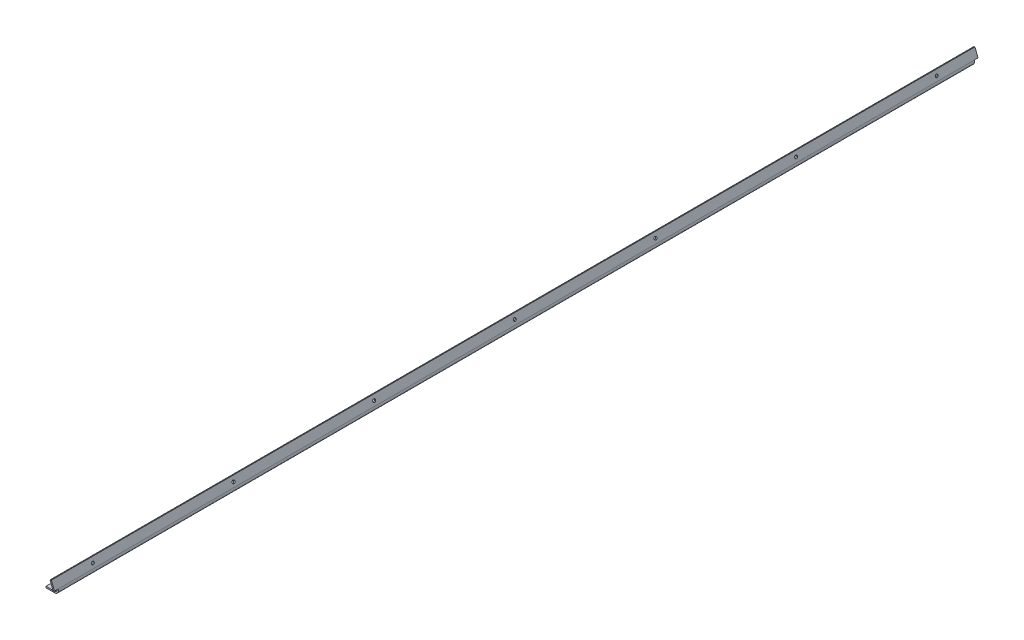
ISO-10303-21;
HEADER;
FILE_DESCRIPTION(('STEP AP214'),'2;1');
FILE_NAME('part.step','',(''),(''),'','','');
FILE_SCHEMA(('AUTOMOTIVE_DESIGN { 1 0 10303 214 1 1 1 1 }'));
ENDSEC;
DATA;
#1=APPLICATION_CONTEXT('core data for automotive mechanical design processes');
#2=APPLICATION_PROTOCOL_DEFINITION('international standard','automotive_design',2000,#1);
#3=PRODUCT_CONTEXT('',#1,'mechanical');
#4=PRODUCT('Part','Part','',(#3));
#5=PRODUCT_RELATED_PRODUCT_CATEGORY('part','',(#4));
#6=PRODUCT_DEFINITION_FORMATION('','',#4);
#7=PRODUCT_DEFINITION_CONTEXT('part definition',#1,'design');
#8=PRODUCT_DEFINITION('design','',#6,#7);
#9=PRODUCT_DEFINITION_SHAPE('','',#8);
#10=(LENGTH_UNIT() NAMED_UNIT(*) SI_UNIT(.MILLI.,.METRE.));
#11=(NAMED_UNIT(*) PLANE_ANGLE_UNIT() SI_UNIT($,.RADIAN.));
#12=(NAMED_UNIT(*) SI_UNIT($,.STERADIAN.) SOLID_ANGLE_UNIT());
#13=UNCERTAINTY_MEASURE_WITH_UNIT(LENGTH_MEASURE(1.E-05),#10,'distance_accuracy_value','');
#14=(GEOMETRIC_REPRESENTATION_CONTEXT(3) GLOBAL_UNCERTAINTY_ASSIGNED_CONTEXT((#13)) GLOBAL_UNIT_ASSIGNED_CONTEXT((#10,
#11,#12)) REPRESENTATION_CONTEXT('',''));
#15=CARTESIAN_POINT('',(0.,0.,0.));
#16=DIRECTION('',(0.,0.,1.));
#17=DIRECTION('',(1.,0.,0.));
#18=AXIS2_PLACEMENT_3D('',#15,#16,#17);
#19=CARTESIAN_POINT('',(-11.5613673458875,8.,985.));
#20=DIRECTION('',(0.,0.,-1.));
#21=DIRECTION('',(-1.,0.,0.));
#22=AXIS2_PLACEMENT_3D('',#19,#20,#21);
#23=CYLINDRICAL_SURFACE('',#22,5.);
#24=DIRECTION('',(0.,0.,-1.));
#25=VECTOR('',#24,1.);
#26=CARTESIAN_POINT('',(-6.88219611129137,9.7622021896844,985.));
#27=LINE('',#26,#25);
#28=CARTESIAN_POINT('',(-6.88219611129137,9.7622021896844,977.));
#29=VERTEX_POINT('',#28);
#30=CARTESIAN_POINT('',(-6.88219611129137,9.7622021896844,-976.999999999999));
#31=VERTEX_POINT('',#30);
#32=EDGE_CURVE('E169',#29,#31,#27,.T.);
#33=ORIENTED_EDGE('',*,*,#32,.T.);
#34=CARTESIAN_POINT('',(-11.5613673458875,8.,-977.));
#35=DIRECTION('',(0.,0.,-1.));
#36=DIRECTION('',(0.,1.,0.));
#37=AXIS2_PLACEMENT_3D('',#34,#35,#36);
#38=CIRCLE('',#37,5.);
#39=CARTESIAN_POINT('',(-11.5613673458875,3.,-977.));
#40=VERTEX_POINT('',#39);
#41=EDGE_CURVE('E216',#31,#40,#38,.T.);
#42=ORIENTED_EDGE('',*,*,#41,.T.);
#43=DIRECTION('',(0.,0.,-1.));
#44=VECTOR('',#43,1.);
#45=CARTESIAN_POINT('',(-11.5613673458875,3.,985.));
#46=LINE('',#45,#44);
#47=CARTESIAN_POINT('',(-11.5613673458875,3.,977.));
#48=VERTEX_POINT('',#47);
#49=EDGE_CURVE('E166',#48,#40,#46,.T.);
#50=ORIENTED_EDGE('',*,*,#49,.F.);
#51=CARTESIAN_POINT('',(-11.5613673458875,8.,977.));
#52=DIRECTION('',(0.,0.,-1.));
#53=DIRECTION('',(0.,1.,0.));
#54=AXIS2_PLACEMENT_3D('',#51,#52,#53);
#55=CIRCLE('',#54,5.);
#56=EDGE_CURVE('E209',#29,#48,#55,.T.);
#57=ORIENTED_EDGE('',*,*,#56,.F.);
#58=EDGE_LOOP('',(#33,#42,#50,#57));
#59=FACE_BOUND('',#58,.T.);
#60=ADVANCED_FACE('F37',(#59),#23,.F.);
#61=CARTESIAN_POINT('',(0.,3.,985.));
#62=DIRECTION('',(0.,1.,0.));
#63=DIRECTION('',(-1.,0.,0.));
#64=AXIS2_PLACEMENT_3D('',#61,#62,#63);
#65=PLANE('',#64);
#66=ORIENTED_EDGE('',*,*,#49,.T.);
#67=DIRECTION('',(-1.,0.,0.));
#68=VECTOR('',#67,1.);
#69=CARTESIAN_POINT('',(0.,3.,-977.));
#70=LINE('',#69,#68);
#71=CARTESIAN_POINT('',(-30.,3.,-977.));
#72=VERTEX_POINT('',#71);
#73=EDGE_CURVE('E142',#40,#72,#70,.T.);
#74=ORIENTED_EDGE('',*,*,#73,.T.);
#75=DIRECTION('',(0.,0.,-1.));
#76=VECTOR('',#75,1.);
#77=CARTESIAN_POINT('',(-30.,3.,985.));
#78=LINE('',#77,#76);
#79=CARTESIAN_POINT('',(-30.,3.,977.));
#80=VERTEX_POINT('',#79);
#81=EDGE_CURVE('E158',#80,#72,#78,.T.);
#82=ORIENTED_EDGE('',*,*,#81,.F.);
#83=DIRECTION('',(-1.,0.,0.));
#84=VECTOR('',#83,1.);
#85=CARTESIAN_POINT('',(0.,3.,977.));
#86=LINE('',#85,#84);
#87=EDGE_CURVE('E201',#48,#80,#86,.T.);
#88=ORIENTED_EDGE('',*,*,#87,.F.);
#89=EDGE_LOOP('',(#66,#74,#82,#88));
#90=FACE_BOUND('',#89,.T.);
#91=ADVANCED_FACE('F268',(#90),#65,.T.);
#92=CARTESIAN_POINT('',(-30.,0.,985.));
#93=DIRECTION('',(-1.,0.,0.));
#94=DIRECTION('',(0.,0.,1.));
#95=AXIS2_PLACEMENT_3D('',#92,#93,#94);
#96=PLANE('',#95);
#97=ORIENTED_EDGE('',*,*,#81,.T.);
#98=DIRECTION('',(0.,1.,0.));
#99=VECTOR('',#98,1.);
#100=CARTESIAN_POINT('',(-30.,3.,-977.));
#101=LINE('',#100,#99);
#102=CARTESIAN_POINT('',(-30.,0.,-976.999999999999));
#103=VERTEX_POINT('',#102);
#104=EDGE_CURVE('E143',#72,#103,#101,.F.);
#105=ORIENTED_EDGE('',*,*,#104,.T.);
#106=DIRECTION('',(0.,0.,-1.));
#107=VECTOR('',#106,1.);
#108=CARTESIAN_POINT('',(-30.,0.,985.));
#109=LINE('',#108,#107);
#110=CARTESIAN_POINT('',(-30.,0.,977.));
#111=VERTEX_POINT('',#110);
#112=EDGE_CURVE('E152',#111,#103,#109,.T.);
#113=ORIENTED_EDGE('',*,*,#112,.F.);
#114=DIRECTION('',(0.,-1.,0.));
#115=VECTOR('',#114,1.);
#116=CARTESIAN_POINT('',(-30.,0.,977.));
#117=LINE('',#116,#115);
#118=EDGE_CURVE('E193',#111,#80,#117,.F.);
#119=ORIENTED_EDGE('',*,*,#118,.T.);
#120=EDGE_LOOP('',(#97,#105,#113,#119));
#121=FACE_BOUND('',#120,.T.);
#122=ADVANCED_FACE('F265',(#121),#96,.T.);
#123=CARTESIAN_POINT('',(0.,0.,985.));
#124=DIRECTION('',(0.,1.,0.));
#125=DIRECTION('',(-1.,0.,0.));
#126=AXIS2_PLACEMENT_3D('',#123,#124,#125);
#127=PLANE('',#126);
#128=DIRECTION('',(-1.,0.,0.));
#129=VECTOR('',#128,1.);
#130=CARTESIAN_POINT('',(0.,0.,-976.999999999999));
#131=LINE('',#130,#129);
#132=CARTESIAN_POINT('',(-11.5613673458875,0.,-976.999999999999));
#133=VERTEX_POINT('',#132);
#134=EDGE_CURVE('E139',#133,#103,#131,.T.);
#135=ORIENTED_EDGE('',*,*,#134,.F.);
#136=DIRECTION('',(0.,0.,-1.));
#137=VECTOR('',#136,1.);
#138=CARTESIAN_POINT('',(-11.5613673458875,0.,985.));
#139=LINE('',#138,#137);
#140=CARTESIAN_POINT('',(-11.5613673458875,0.,977.));
#141=VERTEX_POINT('',#140);
#142=EDGE_CURVE('E150',#141,#133,#139,.T.);
#143=ORIENTED_EDGE('',*,*,#142,.F.);
#144=DIRECTION('',(-1.,0.,0.));
#145=VECTOR('',#144,1.);
#146=CARTESIAN_POINT('',(-3.56136734588746,0.,977.));
#147=LINE('',#146,#145);
#148=EDGE_CURVE('E204',#141,#111,#147,.T.);
#149=ORIENTED_EDGE('',*,*,#148,.T.);
#150=ORIENTED_EDGE('',*,*,#112,.T.);
#151=EDGE_LOOP('',(#135,#143,#149,#150));
#152=FACE_BOUND('',#151,.T.);
#153=ADVANCED_FACE('F148',(#152),#127,.F.);
#154=CARTESIAN_POINT('',(-11.5613673458875,8.,985.));
#155=DIRECTION('',(0.,0.,-1.));
#156=DIRECTION('',(-1.,0.,0.));
#157=AXIS2_PLACEMENT_3D('',#154,#155,#156);
#158=CYLINDRICAL_SURFACE('',#157,8.);
#159=CARTESIAN_POINT('',(-11.5613673458875,8.,-976.999999999999));
#160=DIRECTION('',(0.,0.,-1.));
#161=DIRECTION('',(-1.,0.,0.));
#162=AXIS2_PLACEMENT_3D('',#159,#160,#161);
#163=CIRCLE('',#162,8.);
#164=CARTESIAN_POINT('',(-4.07469337053372,10.819523503495,-976.999999999999));
#165=VERTEX_POINT('',#164);
#166=EDGE_CURVE('E124',#165,#133,#163,.T.);
#167=ORIENTED_EDGE('',*,*,#166,.F.);
#168=DIRECTION('',(0.,0.,-1.));
#169=VECTOR('',#168,1.);
#170=CARTESIAN_POINT('',(-4.07469337053372,10.819523503495,985.));
#171=LINE('',#170,#169);
#172=CARTESIAN_POINT('',(-4.07469337053372,10.819523503495,977.));
#173=VERTEX_POINT('',#172);
#174=EDGE_CURVE('E160',#173,#165,#171,.T.);
#175=ORIENTED_EDGE('',*,*,#174,.F.);
#176=CARTESIAN_POINT('',(-11.5613673458875,8.,977.));
#177=DIRECTION('',(0.,0.,-1.));
#178=DIRECTION('',(-1.,0.,0.));
#179=AXIS2_PLACEMENT_3D('',#176,#177,#178);
#180=CIRCLE('',#179,8.);
#181=EDGE_CURVE('E156',#173,#141,#180,.T.);
#182=ORIENTED_EDGE('',*,*,#181,.T.);
#183=ORIENTED_EDGE('',*,*,#142,.T.);
#184=EDGE_LOOP('',(#167,#175,#182,#183));
#185=FACE_BOUND('',#184,.T.);
#186=ADVANCED_FACE('F155',(#185),#158,.T.);
#187=CARTESIAN_POINT('',(-11.5613673458875,3.,-985.));
#188=DIRECTION('',(0.,0.,-1.));
#189=DIRECTION('',(-1.,0.,0.));
#190=AXIS2_PLACEMENT_3D('',#187,#188,#189);
#191=PLANE('',#190);
#192=DIRECTION('',(-0.35244043793688,0.935834246919218,0.));
#193=VECTOR('',#192,1.);
#194=CARTESIAN_POINT('',(0.,0.,-985.));
#195=LINE('',#194,#193);
#196=CARTESIAN_POINT('',(-4.07469337053372,10.819523503495,-985.));
#197=VERTEX_POINT('',#196);
#198=CARTESIAN_POINT('',(-10.5732131381064,28.0750274075766,-985.));
#199=VERTEX_POINT('',#198);
#200=EDGE_CURVE('E181',#197,#199,#195,.T.);
#201=ORIENTED_EDGE('',*,*,#200,.F.);
#202=DIRECTION('',(-0.935834246919218,-0.35244043793688,0.));
#203=VECTOR('',#202,1.);
#204=CARTESIAN_POINT('',(-4.07469337053372,10.819523503495,-985.));
#205=LINE('',#204,#203);
#206=CARTESIAN_POINT('',(-6.88219611129137,9.7622021896844,-985.));
#207=VERTEX_POINT('',#206);
#208=EDGE_CURVE('E45',#197,#207,#205,.T.);
#209=ORIENTED_EDGE('',*,*,#208,.T.);
#210=DIRECTION('',(-0.35244043793688,0.935834246919218,0.));
#211=VECTOR('',#210,1.);
#212=CARTESIAN_POINT('',(-2.80750274075766,-1.05732131381064,-985.));
#213=LINE('',#212,#211);
#214=CARTESIAN_POINT('',(-13.380715878864,27.0177060937659,-985.));
#215=VERTEX_POINT('',#214);
#216=EDGE_CURVE('E179',#207,#215,#213,.T.);
#217=ORIENTED_EDGE('',*,*,#216,.T.);
#218=DIRECTION('',(0.935834246919219,0.352440437936879,0.));
#219=VECTOR('',#218,1.);
#220=CARTESIAN_POINT('',(-13.380715878864,27.0177060937659,-985.));
#221=LINE('',#220,#219);
#222=EDGE_CURVE('E187',#215,#199,#221,.T.);
#223=ORIENTED_EDGE('',*,*,#222,.T.);
#224=EDGE_LOOP('',(#201,#209,#217,#223));
#225=FACE_BOUND('',#224,.T.);
#226=ADVANCED_FACE('F39',(#225),#191,.T.);
#227=CARTESIAN_POINT('',(0.,0.,985.));
#228=DIRECTION('',(-0.935834246919218,-0.35244043793688,0.));
#229=DIRECTION('',(0.35244043793688,-0.935834246919218,0.));
#230=AXIS2_PLACEMENT_3D('',#227,#228,#229);
#231=PLANE('',#230);
#232=CARTESIAN_POINT('',(-7.07589697904258,18.7886122245888,-300.));
#233=DIRECTION('',(0.935834246919218,0.35244043793688,0.));
#234=DIRECTION('',(0.,0.,1.));
#235=AXIS2_PLACEMENT_3D('',#232,#233,#234);
#236=ELLIPSE('',#235,3.,2.99981479561698);
#237=CARTESIAN_POINT('',(-7.07589697904258,18.7886122245888,-297.));
#238=VERTEX_POINT('',#237);
#239=EDGE_CURVE('E223',#238,#238,#236,.T.);
#240=ORIENTED_EDGE('',*,*,#239,.F.);
#241=EDGE_LOOP('',(#240));
#242=FACE_BOUND('',#241,.T.);
#243=CARTESIAN_POINT('',(-7.07589697904258,18.7886122245888,3.80262231935686E-13));
#244=DIRECTION('',(0.935834246919218,0.35244043793688,0.));
#245=DIRECTION('',(0.,0.,1.));
#246=AXIS2_PLACEMENT_3D('',#243,#244,#245);
#247=ELLIPSE('',#246,3.,2.99981479561698);
#248=CARTESIAN_POINT('',(-7.07589697904258,18.7886122245888,3.00000000000038));
#249=VERTEX_POINT('',#248);
#250=EDGE_CURVE('E295',#249,#249,#247,.T.);
#251=ORIENTED_EDGE('',*,*,#250,.F.);
#252=EDGE_LOOP('',(#251));
#253=FACE_BOUND('',#252,.T.);
#254=CARTESIAN_POINT('',(-7.07589697904258,18.7886122245888,300.));
#255=DIRECTION('',(0.935834246919218,0.35244043793688,0.));
#256=DIRECTION('',(0.,0.,-1.));
#257=AXIS2_PLACEMENT_3D('',#254,#255,#256);
#258=ELLIPSE('',#257,3.,2.99981479561698);
#259=CARTESIAN_POINT('',(-7.07589697904258,18.7886122245888,297.));
#260=VERTEX_POINT('',#259);
#261=EDGE_CURVE('E299',#260,#260,#258,.T.);
#262=ORIENTED_EDGE('',*,*,#261,.F.);
#263=EDGE_LOOP('',(#262));
#264=FACE_BOUND('',#263,.T.);
#265=CARTESIAN_POINT('',(-7.07589697904258,18.7886122245888,600.));
#266=DIRECTION('',(0.935834246919218,0.35244043793688,0.));
#267=DIRECTION('',(0.,0.,-1.));
#268=AXIS2_PLACEMENT_3D('',#265,#266,#267);
#269=ELLIPSE('',#268,3.,2.99981479561703);
#270=CARTESIAN_POINT('',(-7.07589697904258,18.7886122245888,597.));
#271=VERTEX_POINT('',#270);
#272=EDGE_CURVE('E303',#271,#271,#269,.T.);
#273=ORIENTED_EDGE('',*,*,#272,.F.);
#274=EDGE_LOOP('',(#273));
#275=FACE_BOUND('',#274,.T.);
#276=CARTESIAN_POINT('',(-7.07589697904258,18.7886122245888,900.));
#277=DIRECTION('',(0.935834246919218,0.35244043793688,0.));
#278=DIRECTION('',(0.,0.,-1.));
#279=AXIS2_PLACEMENT_3D('',#276,#277,#278);
#280=ELLIPSE('',#279,3.,2.99981479561703);
#281=CARTESIAN_POINT('',(-7.07589697904258,18.7886122245888,897.));
#282=VERTEX_POINT('',#281);
#283=EDGE_CURVE('E307',#282,#282,#280,.T.);
#284=ORIENTED_EDGE('',*,*,#283,.F.);
#285=EDGE_LOOP('',(#284));
#286=FACE_BOUND('',#285,.T.);
#287=CARTESIAN_POINT('',(-7.07589697904258,18.7886122245888,-900.));
#288=DIRECTION('',(0.935834246919218,0.35244043793688,0.));
#289=DIRECTION('',(0.,0.,1.));
#290=AXIS2_PLACEMENT_3D('',#287,#288,#289);
#291=ELLIPSE('',#290,3.,2.99981479561703);
#292=CARTESIAN_POINT('',(-7.07589697904258,18.7886122245888,-897.));
#293=VERTEX_POINT('',#292);
#294=EDGE_CURVE('E311',#293,#293,#291,.T.);
#295=ORIENTED_EDGE('',*,*,#294,.F.);
#296=EDGE_LOOP('',(#295));
#297=FACE_BOUND('',#296,.T.);
#298=CARTESIAN_POINT('',(-7.07589697904258,18.7886122245888,-600.));
#299=DIRECTION('',(0.935834246919218,0.35244043793688,0.));
#300=DIRECTION('',(0.,0.,1.));
#301=AXIS2_PLACEMENT_3D('',#298,#299,#300);
#302=ELLIPSE('',#301,3.,2.99981479561703);
#303=CARTESIAN_POINT('',(-7.07589697904258,18.7886122245888,-597.));
#304=VERTEX_POINT('',#303);
#305=EDGE_CURVE('E218',#304,#304,#302,.T.);
#306=ORIENTED_EDGE('',*,*,#305,.F.);
#307=EDGE_LOOP('',(#306));
#308=FACE_BOUND('',#307,.T.);
#309=ORIENTED_EDGE('',*,*,#200,.T.);
#310=DIRECTION('',(0.,0.,-1.));
#311=VECTOR('',#310,1.);
#312=CARTESIAN_POINT('',(-10.5732131381064,28.0750274075766,985.));
#313=LINE('',#312,#311);
#314=CARTESIAN_POINT('',(-10.5732131381064,28.0750274075766,985.));
#315=VERTEX_POINT('',#314);
#316=EDGE_CURVE('E173',#315,#199,#313,.T.);
#317=ORIENTED_EDGE('',*,*,#316,.F.);
#318=DIRECTION('',(-0.35244043793688,0.935834246919218,0.));
#319=VECTOR('',#318,1.);
#320=CARTESIAN_POINT('',(0.,0.,985.));
#321=LINE('',#320,#319);
#322=CARTESIAN_POINT('',(-4.07469337053372,10.819523503495,985.));
#323=VERTEX_POINT('',#322);
#324=EDGE_CURVE('E81',#323,#315,#321,.T.);
#325=ORIENTED_EDGE('',*,*,#324,.F.);
#326=EDGE_CURVE('E61',#323,#173,#171,.T.);
#327=ORIENTED_EDGE('',*,*,#326,.T.);
#328=ORIENTED_EDGE('',*,*,#174,.T.);
#329=DIRECTION('',(0.,0.,-1.));
#330=VECTOR('',#329,1.);
#331=CARTESIAN_POINT('',(-4.07469337053372,10.819523503495,985.));
#332=LINE('',#331,#330);
#333=EDGE_CURVE('E133',#165,#197,#332,.T.);
#334=ORIENTED_EDGE('',*,*,#333,.T.);
#335=EDGE_LOOP('',(#309,#317,#325,#327,#328,#334));
#336=FACE_BOUND('',#335,.T.);
#337=ADVANCED_FACE('F281',(#242,#253,#264,#275,#286,#297,#308,#336),#231,.F.);
#338=CARTESIAN_POINT('',(-13.380715878864,27.0177060937659,985.));
#339=DIRECTION('',(-0.352440437936879,0.935834246919219,0.));
#340=DIRECTION('',(-0.935834246919219,-0.352440437936879,0.));
#341=AXIS2_PLACEMENT_3D('',#338,#339,#340);
#342=PLANE('',#341);
#343=ORIENTED_EDGE('',*,*,#222,.F.);
#344=DIRECTION('',(0.,0.,-1.));
#345=VECTOR('',#344,1.);
#346=CARTESIAN_POINT('',(-13.380715878864,27.0177060937659,985.));
#347=LINE('',#346,#345);
#348=CARTESIAN_POINT('',(-13.380715878864,27.0177060937659,985.));
#349=VERTEX_POINT('',#348);
#350=EDGE_CURVE('E75',#349,#215,#347,.T.);
#351=ORIENTED_EDGE('',*,*,#350,.F.);
#352=DIRECTION('',(0.935834246919219,0.352440437936879,0.));
#353=VECTOR('',#352,1.);
#354=CARTESIAN_POINT('',(-13.380715878864,27.0177060937659,985.));
#355=LINE('',#354,#353);
#356=EDGE_CURVE('E188',#349,#315,#355,.T.);
#357=ORIENTED_EDGE('',*,*,#356,.T.);
#358=ORIENTED_EDGE('',*,*,#316,.T.);
#359=EDGE_LOOP('',(#343,#351,#357,#358));
#360=FACE_BOUND('',#359,.T.);
#361=ADVANCED_FACE('F278',(#360),#342,.T.);
#362=CARTESIAN_POINT('',(-2.80750274075766,-1.05732131381064,985.));
#363=DIRECTION('',(-0.935834246919218,-0.35244043793688,0.));
#364=DIRECTION('',(0.35244043793688,-0.935834246919218,0.));
#365=AXIS2_PLACEMENT_3D('',#362,#363,#364);
#366=PLANE('',#365);
#367=CARTESIAN_POINT('',(-9.88339971980025,17.7312909107782,-300.));
#368=DIRECTION('',(0.935834246919218,0.35244043793688,0.));
#369=DIRECTION('',(0.,0.,1.));
#370=AXIS2_PLACEMENT_3D('',#367,#368,#369);
#371=ELLIPSE('',#370,3.,2.99981479561698);
#372=CARTESIAN_POINT('',(-9.88339971980025,17.7312909107782,-297.));
#373=VERTEX_POINT('',#372);
#374=EDGE_CURVE('E352',#373,#373,#371,.T.);
#375=ORIENTED_EDGE('',*,*,#374,.T.);
#376=EDGE_LOOP('',(#375));
#377=FACE_BOUND('',#376,.T.);
#378=CARTESIAN_POINT('',(-9.88339971980025,17.7312909107782,3.80262231935686E-13));
#379=DIRECTION('',(0.935834246919218,0.35244043793688,0.));
#380=DIRECTION('',(0.,0.,1.));
#381=AXIS2_PLACEMENT_3D('',#378,#379,#380);
#382=ELLIPSE('',#381,3.,2.99981479561698);
#383=CARTESIAN_POINT('',(-9.88339971980025,17.7312909107782,3.00000000000038));
#384=VERTEX_POINT('',#383);
#385=EDGE_CURVE('E354',#384,#384,#382,.T.);
#386=ORIENTED_EDGE('',*,*,#385,.T.);
#387=EDGE_LOOP('',(#386));
#388=FACE_BOUND('',#387,.T.);
#389=CARTESIAN_POINT('',(-9.88339971980024,17.7312909107782,300.));
#390=DIRECTION('',(0.935834246919218,0.35244043793688,0.));
#391=DIRECTION('',(0.,0.,-1.));
#392=AXIS2_PLACEMENT_3D('',#389,#390,#391);
#393=ELLIPSE('',#392,3.,2.99981479561698);
#394=CARTESIAN_POINT('',(-9.88339971980024,17.7312909107782,297.));
#395=VERTEX_POINT('',#394);
#396=EDGE_CURVE('E359',#395,#395,#393,.T.);
#397=ORIENTED_EDGE('',*,*,#396,.T.);
#398=EDGE_LOOP('',(#397));
#399=FACE_BOUND('',#398,.T.);
#400=CARTESIAN_POINT('',(-9.88339971980024,17.7312909107782,600.));
#401=DIRECTION('',(0.935834246919218,0.35244043793688,0.));
#402=DIRECTION('',(0.,0.,-1.));
#403=AXIS2_PLACEMENT_3D('',#400,#401,#402);
#404=ELLIPSE('',#403,3.,2.99981479561703);
#405=CARTESIAN_POINT('',(-9.88339971980024,17.7312909107782,597.));
#406=VERTEX_POINT('',#405);
#407=EDGE_CURVE('E228',#406,#406,#404,.T.);
#408=ORIENTED_EDGE('',*,*,#407,.T.);
#409=EDGE_LOOP('',(#408));
#410=FACE_BOUND('',#409,.T.);
#411=CARTESIAN_POINT('',(-9.88339971980024,17.7312909107782,900.));
#412=DIRECTION('',(0.935834246919218,0.35244043793688,0.));
#413=DIRECTION('',(0.,0.,-1.));
#414=AXIS2_PLACEMENT_3D('',#411,#412,#413);
#415=ELLIPSE('',#414,3.,2.99981479561703);
#416=CARTESIAN_POINT('',(-9.88339971980024,17.7312909107782,897.));
#417=VERTEX_POINT('',#416);
#418=EDGE_CURVE('E324',#417,#417,#415,.T.);
#419=ORIENTED_EDGE('',*,*,#418,.T.);
#420=EDGE_LOOP('',(#419));
#421=FACE_BOUND('',#420,.T.);
#422=CARTESIAN_POINT('',(-9.88339971980025,17.7312909107782,-900.));
#423=DIRECTION('',(0.935834246919218,0.35244043793688,0.));
#424=DIRECTION('',(0.,0.,1.));
#425=AXIS2_PLACEMENT_3D('',#422,#423,#424);
#426=ELLIPSE('',#425,3.,2.99981479561703);
#427=CARTESIAN_POINT('',(-9.88339971980025,17.7312909107782,-897.));
#428=VERTEX_POINT('',#427);
#429=EDGE_CURVE('E325',#428,#428,#426,.T.);
#430=ORIENTED_EDGE('',*,*,#429,.T.);
#431=EDGE_LOOP('',(#430));
#432=FACE_BOUND('',#431,.T.);
#433=CARTESIAN_POINT('',(-9.88339971980025,17.7312909107782,-600.));
#434=DIRECTION('',(0.935834246919218,0.35244043793688,0.));
#435=DIRECTION('',(0.,0.,1.));
#436=AXIS2_PLACEMENT_3D('',#433,#434,#435);
#437=ELLIPSE('',#436,3.,2.99981479561703);
#438=CARTESIAN_POINT('',(-9.88339971980025,17.7312909107782,-597.));
#439=VERTEX_POINT('',#438);
#440=EDGE_CURVE('E220',#439,#439,#437,.T.);
#441=ORIENTED_EDGE('',*,*,#440,.T.);
#442=EDGE_LOOP('',(#441));
#443=FACE_BOUND('',#442,.T.);
#444=ORIENTED_EDGE('',*,*,#216,.F.);
#445=DIRECTION('',(0.,0.,-1.));
#446=VECTOR('',#445,1.);
#447=CARTESIAN_POINT('',(-6.88219611129137,9.7622021896844,985.));
#448=LINE('',#447,#446);
#449=EDGE_CURVE('E134',#31,#207,#448,.T.);
#450=ORIENTED_EDGE('',*,*,#449,.F.);
#451=ORIENTED_EDGE('',*,*,#32,.F.);
#452=CARTESIAN_POINT('',(-6.88219611129137,9.7622021896844,985.));
#453=VERTEX_POINT('',#452);
#454=EDGE_CURVE('E170',#453,#29,#27,.T.);
#455=ORIENTED_EDGE('',*,*,#454,.F.);
#456=DIRECTION('',(-0.35244043793688,0.935834246919218,0.));
#457=VECTOR('',#456,1.);
#458=CARTESIAN_POINT('',(-2.80750274075766,-1.05732131381064,985.));
#459=LINE('',#458,#457);
#460=EDGE_CURVE('E194',#453,#349,#459,.T.);
#461=ORIENTED_EDGE('',*,*,#460,.T.);
#462=ORIENTED_EDGE('',*,*,#350,.T.);
#463=EDGE_LOOP('',(#444,#450,#451,#455,#461,#462));
#464=FACE_BOUND('',#463,.T.);
#465=ADVANCED_FACE('F184',(#377,#388,#399,#410,#421,#432,#443,#464),#366,.T.);
#466=CARTESIAN_POINT('',(-11.5613673458875,8.,985.));
#467=DIRECTION('',(0.,0.,1.));
#468=DIRECTION('',(1.,0.,0.));
#469=AXIS2_PLACEMENT_3D('',#466,#467,#468);
#470=PLANE('',#469);
#471=ORIENTED_EDGE('',*,*,#324,.T.);
#472=ORIENTED_EDGE('',*,*,#356,.F.);
#473=ORIENTED_EDGE('',*,*,#460,.F.);
#474=DIRECTION('',(0.935834246919218,0.35244043793688,0.));
#475=VECTOR('',#474,1.);
#476=CARTESIAN_POINT('',(-6.88219611129137,9.7622021896844,985.));
#477=LINE('',#476,#475);
#478=EDGE_CURVE('E11',#453,#323,#477,.T.);
#479=ORIENTED_EDGE('',*,*,#478,.T.);
#480=EDGE_LOOP('',(#471,#472,#473,#479));
#481=FACE_BOUND('',#480,.T.);
#482=ADVANCED_FACE('F257',(#481),#470,.T.);
#483=CARTESIAN_POINT('',(-3.56136734588746,0.,977.));
#484=DIRECTION('',(0.,0.,-1.));
#485=DIRECTION('',(-1.,0.,0.));
#486=AXIS2_PLACEMENT_3D('',#483,#484,#485);
#487=PLANE('',#486);
#488=ORIENTED_EDGE('',*,*,#118,.F.);
#489=ORIENTED_EDGE('',*,*,#148,.F.);
#490=DIRECTION('',(0.,-1.,0.));
#491=VECTOR('',#490,1.);
#492=CARTESIAN_POINT('',(-11.5613673458875,0.,977.));
#493=LINE('',#492,#491);
#494=EDGE_CURVE('E198',#141,#48,#493,.F.);
#495=ORIENTED_EDGE('',*,*,#494,.T.);
#496=ORIENTED_EDGE('',*,*,#87,.T.);
#497=EDGE_LOOP('',(#488,#489,#495,#496));
#498=FACE_BOUND('',#497,.T.);
#499=ADVANCED_FACE('F251',(#498),#487,.F.);
#500=CARTESIAN_POINT('',(-6.88219611129137,9.7622021896844,981.));
#501=DIRECTION('',(0.35244043793688,-0.935834246919218,0.));
#502=DIRECTION('',(0.,0.,-1.));
#503=AXIS2_PLACEMENT_3D('',#500,#501,#502);
#504=PLANE('',#503);
#505=ORIENTED_EDGE('',*,*,#478,.F.);
#506=ORIENTED_EDGE('',*,*,#454,.T.);
#507=DIRECTION('',(-0.935834246919218,-0.35244043793688,0.));
#508=VECTOR('',#507,1.);
#509=CARTESIAN_POINT('',(-6.88219611129137,9.7622021896844,977.));
#510=LINE('',#509,#508);
#511=EDGE_CURVE('E206',#29,#173,#510,.F.);
#512=ORIENTED_EDGE('',*,*,#511,.T.);
#513=ORIENTED_EDGE('',*,*,#326,.F.);
#514=EDGE_LOOP('',(#505,#506,#512,#513));
#515=FACE_BOUND('',#514,.T.);
#516=ADVANCED_FACE('F248',(#515),#504,.T.);
#517=CARTESIAN_POINT('',(-11.5613673458875,8.,977.));
#518=DIRECTION('',(0.,0.,1.));
#519=DIRECTION('',(0.,-1.,0.));
#520=AXIS2_PLACEMENT_3D('',#517,#518,#519);
#521=PLANE('',#520);
#522=ORIENTED_EDGE('',*,*,#494,.F.);
#523=ORIENTED_EDGE('',*,*,#181,.F.);
#524=ORIENTED_EDGE('',*,*,#511,.F.);
#525=ORIENTED_EDGE('',*,*,#56,.T.);
#526=EDGE_LOOP('',(#522,#523,#524,#525));
#527=FACE_BOUND('',#526,.T.);
#528=ADVANCED_FACE('F247',(#527),#521,.T.);
#529=CARTESIAN_POINT('',(0.,3.,-977.));
#530=DIRECTION('',(0.,0.,-1.));
#531=DIRECTION('',(-1.,0.,0.));
#532=AXIS2_PLACEMENT_3D('',#529,#530,#531);
#533=PLANE('',#532);
#534=ORIENTED_EDGE('',*,*,#104,.F.);
#535=ORIENTED_EDGE('',*,*,#73,.F.);
#536=DIRECTION('',(0.,1.,0.));
#537=VECTOR('',#536,1.);
#538=CARTESIAN_POINT('',(-11.5613673458875,3.,-977.));
#539=LINE('',#538,#537);
#540=EDGE_CURVE('E127',#40,#133,#539,.F.);
#541=ORIENTED_EDGE('',*,*,#540,.T.);
#542=ORIENTED_EDGE('',*,*,#134,.T.);
#543=EDGE_LOOP('',(#534,#535,#541,#542));
#544=FACE_BOUND('',#543,.T.);
#545=ADVANCED_FACE('F138',(#544),#533,.T.);
#546=CARTESIAN_POINT('',(-11.5613673458875,8.,-977.));
#547=DIRECTION('',(0.,0.,1.));
#548=DIRECTION('',(0.,-1.,0.));
#549=AXIS2_PLACEMENT_3D('',#546,#547,#548);
#550=PLANE('',#549);
#551=ORIENTED_EDGE('',*,*,#540,.F.);
#552=ORIENTED_EDGE('',*,*,#41,.F.);
#553=DIRECTION('',(-0.935834246919218,-0.35244043793688,0.));
#554=VECTOR('',#553,1.);
#555=CARTESIAN_POINT('',(-6.88219611129137,9.7622021896844,-977.));
#556=LINE('',#555,#554);
#557=EDGE_CURVE('E52',#31,#165,#556,.F.);
#558=ORIENTED_EDGE('',*,*,#557,.T.);
#559=ORIENTED_EDGE('',*,*,#166,.T.);
#560=EDGE_LOOP('',(#551,#552,#558,#559));
#561=FACE_BOUND('',#560,.T.);
#562=ADVANCED_FACE('F126',(#561),#550,.F.);
#563=CARTESIAN_POINT('',(-6.88219611129137,9.7622021896844,-980.999999999999));
#564=DIRECTION('',(0.35244043793688,-0.935834246919218,0.));
#565=DIRECTION('',(0.,0.,-1.));
#566=AXIS2_PLACEMENT_3D('',#563,#564,#565);
#567=PLANE('',#566);
#568=ORIENTED_EDGE('',*,*,#449,.T.);
#569=ORIENTED_EDGE('',*,*,#208,.F.);
#570=ORIENTED_EDGE('',*,*,#333,.F.);
#571=ORIENTED_EDGE('',*,*,#557,.F.);
#572=EDGE_LOOP('',(#568,#569,#570,#571));
#573=FACE_BOUND('',#572,.T.);
#574=ADVANCED_FACE('F236',(#573),#567,.T.);
#575=CARTESIAN_POINT('',(-33.3506747218179,8.89338322987851,-600.));
#576=DIRECTION('',(0.935834246919218,0.35244043793688,0.));
#577=DIRECTION('',(0.,0.,1.));
#578=AXIS2_PLACEMENT_3D('',#575,#576,#577);
#579=ELLIPSE('',#578,3.,2.99981479561703);
#580=DIRECTION('',(0.935834246919218,0.35244043793688,0.));
#581=VECTOR('',#580,1.);
#582=SURFACE_OF_LINEAR_EXTRUSION('',#579,#581);
#583=ORIENTED_EDGE('',*,*,#440,.F.);
#584=EDGE_LOOP('',(#583));
#585=FACE_BOUND('',#584,.T.);
#586=ORIENTED_EDGE('',*,*,#305,.T.);
#587=EDGE_LOOP('',(#586));
#588=FACE_BOUND('',#587,.T.);
#589=ADVANCED_FACE('F231',(#585,#588),#582,.F.);
#590=CARTESIAN_POINT('',(-33.3506747218179,8.89338322987851,-900.));
#591=DIRECTION('',(0.935834246919218,0.35244043793688,0.));
#592=DIRECTION('',(0.,0.,1.));
#593=AXIS2_PLACEMENT_3D('',#590,#591,#592);
#594=ELLIPSE('',#593,3.,2.99981479561703);
#595=DIRECTION('',(0.935834246919218,0.35244043793688,0.));
#596=VECTOR('',#595,1.);
#597=SURFACE_OF_LINEAR_EXTRUSION('',#594,#596);
#598=ORIENTED_EDGE('',*,*,#429,.F.);
#599=EDGE_LOOP('',(#598));
#600=FACE_BOUND('',#599,.T.);
#601=ORIENTED_EDGE('',*,*,#294,.T.);
#602=EDGE_LOOP('',(#601));
#603=FACE_BOUND('',#602,.T.);
#604=ADVANCED_FACE('F235',(#600,#603),#597,.F.);
#605=CARTESIAN_POINT('',(-33.3506747218179,8.89338322987851,900.));
#606=DIRECTION('',(0.935834246919218,0.35244043793688,0.));
#607=DIRECTION('',(0.,0.,-1.));
#608=AXIS2_PLACEMENT_3D('',#605,#606,#607);
#609=ELLIPSE('',#608,3.,2.99981479561703);
#610=DIRECTION('',(0.935834246919218,0.35244043793688,0.));
#611=VECTOR('',#610,1.);
#612=SURFACE_OF_LINEAR_EXTRUSION('',#609,#611);
#613=ORIENTED_EDGE('',*,*,#418,.F.);
#614=EDGE_LOOP('',(#613));
#615=FACE_BOUND('',#614,.T.);
#616=ORIENTED_EDGE('',*,*,#283,.T.);
#617=EDGE_LOOP('',(#616));
#618=FACE_BOUND('',#617,.T.);
#619=ADVANCED_FACE('F370',(#615,#618),#612,.F.);
#620=CARTESIAN_POINT('',(-33.3506747218179,8.89338322987851,600.));
#621=DIRECTION('',(0.935834246919218,0.35244043793688,0.));
#622=DIRECTION('',(0.,0.,-1.));
#623=AXIS2_PLACEMENT_3D('',#620,#621,#622);
#624=ELLIPSE('',#623,3.,2.99981479561703);
#625=DIRECTION('',(0.935834246919218,0.35244043793688,0.));
#626=VECTOR('',#625,1.);
#627=SURFACE_OF_LINEAR_EXTRUSION('',#624,#626);
#628=ORIENTED_EDGE('',*,*,#407,.F.);
#629=EDGE_LOOP('',(#628));
#630=FACE_BOUND('',#629,.T.);
#631=ORIENTED_EDGE('',*,*,#272,.T.);
#632=EDGE_LOOP('',(#631));
#633=FACE_BOUND('',#632,.T.);
#634=ADVANCED_FACE('F238',(#630,#633),#627,.F.);
#635=CARTESIAN_POINT('',(-33.3506747218179,8.89338322987851,300.));
#636=DIRECTION('',(0.935834246919218,0.35244043793688,0.));
#637=DIRECTION('',(0.,0.,-1.));
#638=AXIS2_PLACEMENT_3D('',#635,#636,#637);
#639=ELLIPSE('',#638,3.,2.99981479561698);
#640=DIRECTION('',(0.935834246919218,0.35244043793688,0.));
#641=VECTOR('',#640,1.);
#642=SURFACE_OF_LINEAR_EXTRUSION('',#639,#641);
#643=ORIENTED_EDGE('',*,*,#396,.F.);
#644=EDGE_LOOP('',(#643));
#645=FACE_BOUND('',#644,.T.);
#646=ORIENTED_EDGE('',*,*,#261,.T.);
#647=EDGE_LOOP('',(#646));
#648=FACE_BOUND('',#647,.T.);
#649=ADVANCED_FACE('F347',(#645,#648),#642,.F.);
#650=CARTESIAN_POINT('',(-33.3506747218179,8.89338322987851,3.80262231935686E-13));
#651=DIRECTION('',(0.935834246919218,0.35244043793688,0.));
#652=DIRECTION('',(0.,0.,1.));
#653=AXIS2_PLACEMENT_3D('',#650,#651,#652);
#654=ELLIPSE('',#653,3.,2.99981479561698);
#655=DIRECTION('',(0.935834246919218,0.35244043793688,0.));
#656=VECTOR('',#655,1.);
#657=SURFACE_OF_LINEAR_EXTRUSION('',#654,#656);
#658=ORIENTED_EDGE('',*,*,#385,.F.);
#659=EDGE_LOOP('',(#658));
#660=FACE_BOUND('',#659,.T.);
#661=ORIENTED_EDGE('',*,*,#250,.T.);
#662=EDGE_LOOP('',(#661));
#663=FACE_BOUND('',#662,.T.);
#664=ADVANCED_FACE('F342',(#660,#663),#657,.F.);
#665=CARTESIAN_POINT('',(-33.3506747218179,8.89338322987851,-300.));
#666=DIRECTION('',(0.935834246919218,0.35244043793688,0.));
#667=DIRECTION('',(0.,0.,1.));
#668=AXIS2_PLACEMENT_3D('',#665,#666,#667);
#669=ELLIPSE('',#668,3.,2.99981479561698);
#670=DIRECTION('',(0.935834246919218,0.35244043793688,0.));
#671=VECTOR('',#670,1.);
#672=SURFACE_OF_LINEAR_EXTRUSION('',#669,#671);
#673=ORIENTED_EDGE('',*,*,#374,.F.);
#674=EDGE_LOOP('',(#673));
#675=FACE_BOUND('',#674,.T.);
#676=ORIENTED_EDGE('',*,*,#239,.T.);
#677=EDGE_LOOP('',(#676));
#678=FACE_BOUND('',#677,.T.);
#679=ADVANCED_FACE('F338',(#675,#678),#672,.F.);
#680=CLOSED_SHELL('',(#60,#91,#122,#153,#186,#226,#337,#361,#465,#482,#499,#516,#528,#545,#562,
#574,#589,#604,#619,#634,#649,#664,#679));
#681=MANIFOLD_SOLID_BREP('B2',#680);
#682=ADVANCED_BREP_SHAPE_REPRESENTATION('',(#18,#681),#14);
#683=SHAPE_DEFINITION_REPRESENTATION(#9,#682);
ENDSEC;
END-ISO-10303-21;
